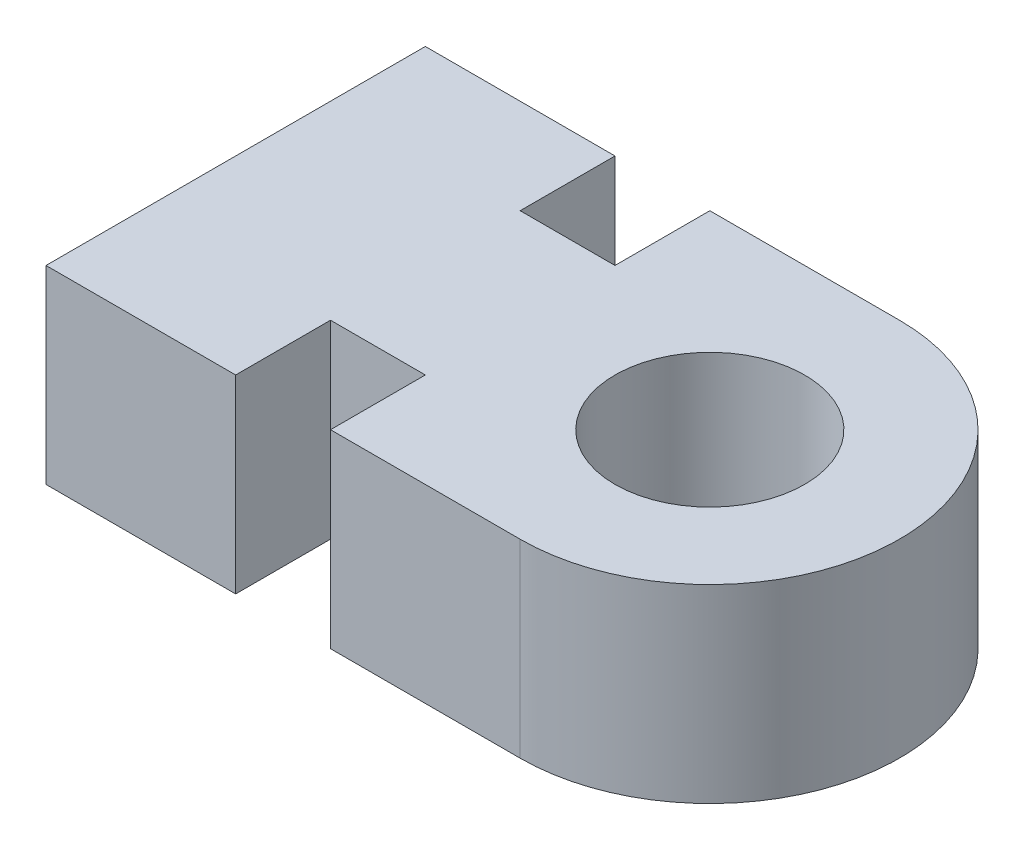
ISO-10303-21;
HEADER;
FILE_DESCRIPTION(('STEP AP214'),'2;1');
FILE_NAME('part.step','',(''),(''),'','','');
FILE_SCHEMA(('AUTOMOTIVE_DESIGN { 1 0 10303 214 1 1 1 1 }'));
ENDSEC;
DATA;
#1=APPLICATION_CONTEXT('core data for automotive mechanical design processes');
#2=APPLICATION_PROTOCOL_DEFINITION('international standard','automotive_design',2000,#1);
#3=PRODUCT_CONTEXT('',#1,'mechanical');
#4=PRODUCT('Part','Part','',(#3));
#5=PRODUCT_RELATED_PRODUCT_CATEGORY('part','',(#4));
#6=PRODUCT_DEFINITION_FORMATION('','',#4);
#7=PRODUCT_DEFINITION_CONTEXT('part definition',#1,'design');
#8=PRODUCT_DEFINITION('design','',#6,#7);
#9=PRODUCT_DEFINITION_SHAPE('','',#8);
#10=(LENGTH_UNIT() NAMED_UNIT(*) SI_UNIT(.MILLI.,.METRE.));
#11=(NAMED_UNIT(*) PLANE_ANGLE_UNIT() SI_UNIT($,.RADIAN.));
#12=(NAMED_UNIT(*) SI_UNIT($,.STERADIAN.) SOLID_ANGLE_UNIT());
#13=UNCERTAINTY_MEASURE_WITH_UNIT(LENGTH_MEASURE(1.E-05),#10,'distance_accuracy_value','');
#14=(GEOMETRIC_REPRESENTATION_CONTEXT(3) GLOBAL_UNCERTAINTY_ASSIGNED_CONTEXT((#13)) GLOBAL_UNIT_ASSIGNED_CONTEXT((#10,
#11,#12)) REPRESENTATION_CONTEXT('',''));
#15=CARTESIAN_POINT('',(0.,0.,0.));
#16=DIRECTION('',(0.,0.,1.));
#17=DIRECTION('',(1.,0.,0.));
#18=AXIS2_PLACEMENT_3D('',#15,#16,#17);
#19=CARTESIAN_POINT('',(0.,20.,0.));
#20=DIRECTION('',(0.,1.,0.));
#21=DIRECTION('',(0.,0.,1.));
#22=AXIS2_PLACEMENT_3D('',#19,#20,#21);
#23=PLANE('',#22);
#24=CARTESIAN_POINT('',(0.,20.,0.));
#25=DIRECTION('',(0.,1.,0.));
#26=DIRECTION('',(0.,0.,1.));
#27=AXIS2_PLACEMENT_3D('',#24,#25,#26);
#28=CIRCLE('',#27,20.);
#29=CARTESIAN_POINT('',(0.,20.,20.));
#30=VERTEX_POINT('',#29);
#31=CARTESIAN_POINT('',(0.,20.,-20.));
#32=VERTEX_POINT('',#31);
#33=EDGE_CURVE('E180',#30,#32,#28,.T.);
#34=ORIENTED_EDGE('',*,*,#33,.T.);
#35=DIRECTION('',(-1.,0.,0.));
#36=VECTOR('',#35,1.);
#37=CARTESIAN_POINT('',(0.,20.,-20.));
#38=LINE('',#37,#36);
#39=CARTESIAN_POINT('',(-20.,20.,-20.));
#40=VERTEX_POINT('',#39);
#41=EDGE_CURVE('E108',#32,#40,#38,.T.);
#42=ORIENTED_EDGE('',*,*,#41,.T.);
#43=DIRECTION('',(0.,0.,1.));
#44=VECTOR('',#43,1.);
#45=CARTESIAN_POINT('',(-20.,20.,-20.));
#46=LINE('',#45,#44);
#47=CARTESIAN_POINT('',(-20.,20.,-10.));
#48=VERTEX_POINT('',#47);
#49=EDGE_CURVE('E207',#40,#48,#46,.T.);
#50=ORIENTED_EDGE('',*,*,#49,.T.);
#51=DIRECTION('',(-1.,0.,0.));
#52=VECTOR('',#51,1.);
#53=CARTESIAN_POINT('',(-20.,20.,-10.));
#54=LINE('',#53,#52);
#55=CARTESIAN_POINT('',(-30.,20.,-10.));
#56=VERTEX_POINT('',#55);
#57=EDGE_CURVE('E226',#48,#56,#54,.T.);
#58=ORIENTED_EDGE('',*,*,#57,.T.);
#59=DIRECTION('',(0.,0.,-1.));
#60=VECTOR('',#59,1.);
#61=CARTESIAN_POINT('',(-30.,20.,-10.));
#62=LINE('',#61,#60);
#63=CARTESIAN_POINT('',(-30.,20.,-20.));
#64=VERTEX_POINT('',#63);
#65=EDGE_CURVE('E223',#56,#64,#62,.T.);
#66=ORIENTED_EDGE('',*,*,#65,.T.);
#67=DIRECTION('',(-1.,0.,0.));
#68=VECTOR('',#67,1.);
#69=CARTESIAN_POINT('',(-30.,20.,-20.));
#70=LINE('',#69,#68);
#71=CARTESIAN_POINT('',(-50.,20.,-20.));
#72=VERTEX_POINT('',#71);
#73=EDGE_CURVE('E225',#64,#72,#70,.T.);
#74=ORIENTED_EDGE('',*,*,#73,.T.);
#75=DIRECTION('',(0.,0.,1.));
#76=VECTOR('',#75,1.);
#77=CARTESIAN_POINT('',(-50.,20.,-20.));
#78=LINE('',#77,#76);
#79=CARTESIAN_POINT('',(-50.,20.,20.));
#80=VERTEX_POINT('',#79);
#81=EDGE_CURVE('E228',#72,#80,#78,.T.);
#82=ORIENTED_EDGE('',*,*,#81,.T.);
#83=DIRECTION('',(1.,0.,0.));
#84=VECTOR('',#83,1.);
#85=CARTESIAN_POINT('',(-50.,20.,20.));
#86=LINE('',#85,#84);
#87=CARTESIAN_POINT('',(-30.,20.,20.));
#88=VERTEX_POINT('',#87);
#89=EDGE_CURVE('E234',#80,#88,#86,.T.);
#90=ORIENTED_EDGE('',*,*,#89,.T.);
#91=DIRECTION('',(0.,0.,-1.));
#92=VECTOR('',#91,1.);
#93=CARTESIAN_POINT('',(-30.,20.,20.));
#94=LINE('',#93,#92);
#95=CARTESIAN_POINT('',(-30.,20.,10.));
#96=VERTEX_POINT('',#95);
#97=EDGE_CURVE('E139',#88,#96,#94,.T.);
#98=ORIENTED_EDGE('',*,*,#97,.T.);
#99=DIRECTION('',(1.,0.,0.));
#100=VECTOR('',#99,1.);
#101=CARTESIAN_POINT('',(-30.,20.,10.));
#102=LINE('',#101,#100);
#103=CARTESIAN_POINT('',(-20.,20.,10.));
#104=VERTEX_POINT('',#103);
#105=EDGE_CURVE('E133',#96,#104,#102,.T.);
#106=ORIENTED_EDGE('',*,*,#105,.T.);
#107=DIRECTION('',(0.,0.,1.));
#108=VECTOR('',#107,1.);
#109=CARTESIAN_POINT('',(-20.,20.,10.));
#110=LINE('',#109,#108);
#111=CARTESIAN_POINT('',(-20.,20.,20.));
#112=VERTEX_POINT('',#111);
#113=EDGE_CURVE('E137',#104,#112,#110,.T.);
#114=ORIENTED_EDGE('',*,*,#113,.T.);
#115=DIRECTION('',(1.,0.,0.));
#116=VECTOR('',#115,1.);
#117=CARTESIAN_POINT('',(-20.,20.,20.));
#118=LINE('',#117,#116);
#119=EDGE_CURVE('E53',#112,#30,#118,.T.);
#120=ORIENTED_EDGE('',*,*,#119,.T.);
#121=EDGE_LOOP('',(#34,#42,#50,#58,#66,#74,#82,#90,#98,#106,#114,#120));
#122=FACE_BOUND('',#121,.T.);
#123=CARTESIAN_POINT('',(0.,20.,0.));
#124=DIRECTION('',(0.,1.,0.));
#125=DIRECTION('',(0.,0.,1.));
#126=AXIS2_PLACEMENT_3D('',#123,#124,#125);
#127=CIRCLE('',#126,10.);
#128=CARTESIAN_POINT('',(0.,20.,10.));
#129=VERTEX_POINT('',#128);
#130=EDGE_CURVE('E161',#129,#129,#127,.T.);
#131=ORIENTED_EDGE('',*,*,#130,.F.);
#132=EDGE_LOOP('',(#131));
#133=FACE_BOUND('',#132,.T.);
#134=ADVANCED_FACE('F36',(#122,#133),#23,.T.);
#135=CARTESIAN_POINT('',(0.,0.,0.));
#136=DIRECTION('',(0.,1.,0.));
#137=DIRECTION('',(0.,0.,1.));
#138=AXIS2_PLACEMENT_3D('',#135,#136,#137);
#139=PLANE('',#138);
#140=CARTESIAN_POINT('',(0.,0.,0.));
#141=DIRECTION('',(0.,1.,0.));
#142=DIRECTION('',(0.,0.,1.));
#143=AXIS2_PLACEMENT_3D('',#140,#141,#142);
#144=CIRCLE('',#143,20.);
#145=CARTESIAN_POINT('',(0.,0.,20.));
#146=VERTEX_POINT('',#145);
#147=CARTESIAN_POINT('',(0.,0.,-20.));
#148=VERTEX_POINT('',#147);
#149=EDGE_CURVE('E157',#146,#148,#144,.T.);
#150=ORIENTED_EDGE('',*,*,#149,.F.);
#151=DIRECTION('',(1.,0.,0.));
#152=VECTOR('',#151,1.);
#153=CARTESIAN_POINT('',(-20.,0.,20.));
#154=LINE('',#153,#152);
#155=CARTESIAN_POINT('',(-20.,0.,20.));
#156=VERTEX_POINT('',#155);
#157=EDGE_CURVE('E100',#156,#146,#154,.T.);
#158=ORIENTED_EDGE('',*,*,#157,.F.);
#159=DIRECTION('',(0.,0.,1.));
#160=VECTOR('',#159,1.);
#161=CARTESIAN_POINT('',(-20.,0.,10.));
#162=LINE('',#161,#160);
#163=CARTESIAN_POINT('',(-20.,0.,10.));
#164=VERTEX_POINT('',#163);
#165=EDGE_CURVE('E94',#164,#156,#162,.T.);
#166=ORIENTED_EDGE('',*,*,#165,.F.);
#167=DIRECTION('',(1.,0.,0.));
#168=VECTOR('',#167,1.);
#169=CARTESIAN_POINT('',(-30.,0.,10.));
#170=LINE('',#169,#168);
#171=CARTESIAN_POINT('',(-30.,0.,10.));
#172=VERTEX_POINT('',#171);
#173=EDGE_CURVE('E147',#172,#164,#170,.T.);
#174=ORIENTED_EDGE('',*,*,#173,.F.);
#175=DIRECTION('',(0.,0.,-1.));
#176=VECTOR('',#175,1.);
#177=CARTESIAN_POINT('',(-30.,0.,20.));
#178=LINE('',#177,#176);
#179=CARTESIAN_POINT('',(-30.,0.,20.));
#180=VERTEX_POINT('',#179);
#181=EDGE_CURVE('E175',#180,#172,#178,.T.);
#182=ORIENTED_EDGE('',*,*,#181,.F.);
#183=DIRECTION('',(1.,0.,0.));
#184=VECTOR('',#183,1.);
#185=CARTESIAN_POINT('',(-50.,0.,20.));
#186=LINE('',#185,#184);
#187=CARTESIAN_POINT('',(-50.,0.,20.));
#188=VERTEX_POINT('',#187);
#189=EDGE_CURVE('E173',#188,#180,#186,.T.);
#190=ORIENTED_EDGE('',*,*,#189,.F.);
#191=DIRECTION('',(0.,0.,1.));
#192=VECTOR('',#191,1.);
#193=CARTESIAN_POINT('',(-50.,0.,-20.));
#194=LINE('',#193,#192);
#195=CARTESIAN_POINT('',(-50.,0.,-20.));
#196=VERTEX_POINT('',#195);
#197=EDGE_CURVE('E171',#196,#188,#194,.T.);
#198=ORIENTED_EDGE('',*,*,#197,.F.);
#199=DIRECTION('',(-1.,0.,0.));
#200=VECTOR('',#199,1.);
#201=CARTESIAN_POINT('',(-30.,0.,-20.));
#202=LINE('',#201,#200);
#203=CARTESIAN_POINT('',(-30.,0.,-20.));
#204=VERTEX_POINT('',#203);
#205=EDGE_CURVE('E169',#204,#196,#202,.T.);
#206=ORIENTED_EDGE('',*,*,#205,.F.);
#207=DIRECTION('',(0.,0.,-1.));
#208=VECTOR('',#207,1.);
#209=CARTESIAN_POINT('',(-30.,0.,-10.));
#210=LINE('',#209,#208);
#211=CARTESIAN_POINT('',(-30.,0.,-10.));
#212=VERTEX_POINT('',#211);
#213=EDGE_CURVE('E167',#212,#204,#210,.T.);
#214=ORIENTED_EDGE('',*,*,#213,.F.);
#215=DIRECTION('',(-1.,0.,0.));
#216=VECTOR('',#215,1.);
#217=CARTESIAN_POINT('',(-20.,0.,-10.));
#218=LINE('',#217,#216);
#219=CARTESIAN_POINT('',(-20.,0.,-10.));
#220=VERTEX_POINT('',#219);
#221=EDGE_CURVE('E165',#220,#212,#218,.T.);
#222=ORIENTED_EDGE('',*,*,#221,.F.);
#223=DIRECTION('',(0.,0.,1.));
#224=VECTOR('',#223,1.);
#225=CARTESIAN_POINT('',(-20.,0.,-20.));
#226=LINE('',#225,#224);
#227=CARTESIAN_POINT('',(-20.,0.,-20.));
#228=VERTEX_POINT('',#227);
#229=EDGE_CURVE('E163',#228,#220,#226,.T.);
#230=ORIENTED_EDGE('',*,*,#229,.F.);
#231=DIRECTION('',(-1.,0.,0.));
#232=VECTOR('',#231,1.);
#233=CARTESIAN_POINT('',(0.,0.,-20.));
#234=LINE('',#233,#232);
#235=EDGE_CURVE('E160',#148,#228,#234,.T.);
#236=ORIENTED_EDGE('',*,*,#235,.F.);
#237=EDGE_LOOP('',(#150,#158,#166,#174,#182,#190,#198,#206,#214,#222,#230,#236));
#238=FACE_BOUND('',#237,.T.);
#239=CARTESIAN_POINT('',(0.,0.,0.));
#240=DIRECTION('',(0.,1.,0.));
#241=DIRECTION('',(0.,0.,1.));
#242=AXIS2_PLACEMENT_3D('',#239,#240,#241);
#243=CIRCLE('',#242,10.);
#244=CARTESIAN_POINT('',(0.,0.,10.));
#245=VERTEX_POINT('',#244);
#246=EDGE_CURVE('E381',#245,#245,#243,.T.);
#247=ORIENTED_EDGE('',*,*,#246,.T.);
#248=EDGE_LOOP('',(#247));
#249=FACE_BOUND('',#248,.T.);
#250=ADVANCED_FACE('F211',(#238,#249),#139,.F.);
#251=CARTESIAN_POINT('',(0.,20.,0.));
#252=DIRECTION('',(0.,-1.,0.));
#253=DIRECTION('',(0.,0.,-1.));
#254=AXIS2_PLACEMENT_3D('',#251,#252,#253);
#255=CYLINDRICAL_SURFACE('',#254,20.);
#256=ORIENTED_EDGE('',*,*,#149,.T.);
#257=DIRECTION('',(0.,-1.,0.));
#258=VECTOR('',#257,1.);
#259=CARTESIAN_POINT('',(0.,20.,-20.));
#260=LINE('',#259,#258);
#261=EDGE_CURVE('E11',#32,#148,#260,.T.);
#262=ORIENTED_EDGE('',*,*,#261,.F.);
#263=ORIENTED_EDGE('',*,*,#33,.F.);
#264=DIRECTION('',(0.,-1.,0.));
#265=VECTOR('',#264,1.);
#266=CARTESIAN_POINT('',(0.,20.,20.));
#267=LINE('',#266,#265);
#268=EDGE_CURVE('E153',#30,#146,#267,.T.);
#269=ORIENTED_EDGE('',*,*,#268,.T.);
#270=EDGE_LOOP('',(#256,#262,#263,#269));
#271=FACE_BOUND('',#270,.T.);
#272=ADVANCED_FACE('F38',(#271),#255,.T.);
#273=CARTESIAN_POINT('',(0.,20.,-20.));
#274=DIRECTION('',(0.,0.,1.));
#275=DIRECTION('',(1.,0.,0.));
#276=AXIS2_PLACEMENT_3D('',#273,#274,#275);
#277=PLANE('',#276);
#278=ORIENTED_EDGE('',*,*,#235,.T.);
#279=DIRECTION('',(0.,-1.,0.));
#280=VECTOR('',#279,1.);
#281=CARTESIAN_POINT('',(-20.,20.,-20.));
#282=LINE('',#281,#280);
#283=EDGE_CURVE('E45',#40,#228,#282,.T.);
#284=ORIENTED_EDGE('',*,*,#283,.F.);
#285=ORIENTED_EDGE('',*,*,#41,.F.);
#286=ORIENTED_EDGE('',*,*,#261,.T.);
#287=EDGE_LOOP('',(#278,#284,#285,#286));
#288=FACE_BOUND('',#287,.T.);
#289=ADVANCED_FACE('F268',(#288),#277,.F.);
#290=CARTESIAN_POINT('',(-20.,20.,-20.));
#291=DIRECTION('',(1.,0.,0.));
#292=DIRECTION('',(0.,0.,-1.));
#293=AXIS2_PLACEMENT_3D('',#290,#291,#292);
#294=PLANE('',#293);
#295=ORIENTED_EDGE('',*,*,#229,.T.);
#296=DIRECTION('',(0.,-1.,0.));
#297=VECTOR('',#296,1.);
#298=CARTESIAN_POINT('',(-20.,20.,-10.));
#299=LINE('',#298,#297);
#300=EDGE_CURVE('E199',#48,#220,#299,.T.);
#301=ORIENTED_EDGE('',*,*,#300,.F.);
#302=ORIENTED_EDGE('',*,*,#49,.F.);
#303=ORIENTED_EDGE('',*,*,#283,.T.);
#304=EDGE_LOOP('',(#295,#301,#302,#303));
#305=FACE_BOUND('',#304,.T.);
#306=ADVANCED_FACE('F205',(#305),#294,.F.);
#307=CARTESIAN_POINT('',(-20.,20.,-10.));
#308=DIRECTION('',(0.,0.,1.));
#309=DIRECTION('',(1.,0.,0.));
#310=AXIS2_PLACEMENT_3D('',#307,#308,#309);
#311=PLANE('',#310);
#312=ORIENTED_EDGE('',*,*,#221,.T.);
#313=DIRECTION('',(0.,-1.,0.));
#314=VECTOR('',#313,1.);
#315=CARTESIAN_POINT('',(-30.,20.,-10.));
#316=LINE('',#315,#314);
#317=EDGE_CURVE('E196',#56,#212,#316,.T.);
#318=ORIENTED_EDGE('',*,*,#317,.F.);
#319=ORIENTED_EDGE('',*,*,#57,.F.);
#320=ORIENTED_EDGE('',*,*,#300,.T.);
#321=EDGE_LOOP('',(#312,#318,#319,#320));
#322=FACE_BOUND('',#321,.T.);
#323=ADVANCED_FACE('F217',(#322),#311,.F.);
#324=CARTESIAN_POINT('',(-30.,20.,-10.));
#325=DIRECTION('',(-1.,0.,0.));
#326=DIRECTION('',(0.,0.,1.));
#327=AXIS2_PLACEMENT_3D('',#324,#325,#326);
#328=PLANE('',#327);
#329=ORIENTED_EDGE('',*,*,#213,.T.);
#330=DIRECTION('',(0.,-1.,0.));
#331=VECTOR('',#330,1.);
#332=CARTESIAN_POINT('',(-30.,20.,-20.));
#333=LINE('',#332,#331);
#334=EDGE_CURVE('E193',#64,#204,#333,.T.);
#335=ORIENTED_EDGE('',*,*,#334,.F.);
#336=ORIENTED_EDGE('',*,*,#65,.F.);
#337=ORIENTED_EDGE('',*,*,#317,.T.);
#338=EDGE_LOOP('',(#329,#335,#336,#337));
#339=FACE_BOUND('',#338,.T.);
#340=ADVANCED_FACE('F221',(#339),#328,.F.);
#341=CARTESIAN_POINT('',(-30.,20.,-20.));
#342=DIRECTION('',(0.,0.,1.));
#343=DIRECTION('',(1.,0.,0.));
#344=AXIS2_PLACEMENT_3D('',#341,#342,#343);
#345=PLANE('',#344);
#346=ORIENTED_EDGE('',*,*,#205,.T.);
#347=DIRECTION('',(0.,-1.,0.));
#348=VECTOR('',#347,1.);
#349=CARTESIAN_POINT('',(-50.,20.,-20.));
#350=LINE('',#349,#348);
#351=EDGE_CURVE('E190',#72,#196,#350,.T.);
#352=ORIENTED_EDGE('',*,*,#351,.F.);
#353=ORIENTED_EDGE('',*,*,#73,.F.);
#354=ORIENTED_EDGE('',*,*,#334,.T.);
#355=EDGE_LOOP('',(#346,#352,#353,#354));
#356=FACE_BOUND('',#355,.T.);
#357=ADVANCED_FACE('F281',(#356),#345,.F.);
#358=CARTESIAN_POINT('',(-50.,20.,-20.));
#359=DIRECTION('',(1.,0.,0.));
#360=DIRECTION('',(0.,0.,-1.));
#361=AXIS2_PLACEMENT_3D('',#358,#359,#360);
#362=PLANE('',#361);
#363=ORIENTED_EDGE('',*,*,#197,.T.);
#364=DIRECTION('',(0.,-1.,0.));
#365=VECTOR('',#364,1.);
#366=CARTESIAN_POINT('',(-50.,20.,20.));
#367=LINE('',#366,#365);
#368=EDGE_CURVE('E187',#80,#188,#367,.T.);
#369=ORIENTED_EDGE('',*,*,#368,.F.);
#370=ORIENTED_EDGE('',*,*,#81,.F.);
#371=ORIENTED_EDGE('',*,*,#351,.T.);
#372=EDGE_LOOP('',(#363,#369,#370,#371));
#373=FACE_BOUND('',#372,.T.);
#374=ADVANCED_FACE('F284',(#373),#362,.F.);
#375=CARTESIAN_POINT('',(-50.,20.,20.));
#376=DIRECTION('',(0.,0.,-1.));
#377=DIRECTION('',(-1.,0.,0.));
#378=AXIS2_PLACEMENT_3D('',#375,#376,#377);
#379=PLANE('',#378);
#380=ORIENTED_EDGE('',*,*,#189,.T.);
#381=DIRECTION('',(0.,-1.,0.));
#382=VECTOR('',#381,1.);
#383=CARTESIAN_POINT('',(-30.,20.,20.));
#384=LINE('',#383,#382);
#385=EDGE_CURVE('E184',#88,#180,#384,.T.);
#386=ORIENTED_EDGE('',*,*,#385,.F.);
#387=ORIENTED_EDGE('',*,*,#89,.F.);
#388=ORIENTED_EDGE('',*,*,#368,.T.);
#389=EDGE_LOOP('',(#380,#386,#387,#388));
#390=FACE_BOUND('',#389,.T.);
#391=ADVANCED_FACE('F240',(#390),#379,.F.);
#392=CARTESIAN_POINT('',(-30.,20.,20.));
#393=DIRECTION('',(-1.,0.,0.));
#394=DIRECTION('',(0.,0.,1.));
#395=AXIS2_PLACEMENT_3D('',#392,#393,#394);
#396=PLANE('',#395);
#397=ORIENTED_EDGE('',*,*,#181,.T.);
#398=DIRECTION('',(0.,-1.,0.));
#399=VECTOR('',#398,1.);
#400=CARTESIAN_POINT('',(-30.,20.,10.));
#401=LINE('',#400,#399);
#402=EDGE_CURVE('E148',#96,#172,#401,.T.);
#403=ORIENTED_EDGE('',*,*,#402,.F.);
#404=ORIENTED_EDGE('',*,*,#97,.F.);
#405=ORIENTED_EDGE('',*,*,#385,.T.);
#406=EDGE_LOOP('',(#397,#403,#404,#405));
#407=FACE_BOUND('',#406,.T.);
#408=ADVANCED_FACE('F244',(#407),#396,.F.);
#409=CARTESIAN_POINT('',(-30.,20.,10.));
#410=DIRECTION('',(0.,0.,-1.));
#411=DIRECTION('',(-1.,0.,0.));
#412=AXIS2_PLACEMENT_3D('',#409,#410,#411);
#413=PLANE('',#412);
#414=ORIENTED_EDGE('',*,*,#173,.T.);
#415=DIRECTION('',(0.,-1.,0.));
#416=VECTOR('',#415,1.);
#417=CARTESIAN_POINT('',(-20.,20.,10.));
#418=LINE('',#417,#416);
#419=EDGE_CURVE('E144',#104,#164,#418,.T.);
#420=ORIENTED_EDGE('',*,*,#419,.F.);
#421=ORIENTED_EDGE('',*,*,#105,.F.);
#422=ORIENTED_EDGE('',*,*,#402,.T.);
#423=EDGE_LOOP('',(#414,#420,#421,#422));
#424=FACE_BOUND('',#423,.T.);
#425=ADVANCED_FACE('F145',(#424),#413,.F.);
#426=CARTESIAN_POINT('',(-20.,20.,10.));
#427=DIRECTION('',(1.,0.,0.));
#428=DIRECTION('',(0.,0.,-1.));
#429=AXIS2_PLACEMENT_3D('',#426,#427,#428);
#430=PLANE('',#429);
#431=ORIENTED_EDGE('',*,*,#165,.T.);
#432=DIRECTION('',(0.,-1.,0.));
#433=VECTOR('',#432,1.);
#434=CARTESIAN_POINT('',(-20.,20.,20.));
#435=LINE('',#434,#433);
#436=EDGE_CURVE('E149',#112,#156,#435,.T.);
#437=ORIENTED_EDGE('',*,*,#436,.F.);
#438=ORIENTED_EDGE('',*,*,#113,.F.);
#439=ORIENTED_EDGE('',*,*,#419,.T.);
#440=EDGE_LOOP('',(#431,#437,#438,#439));
#441=FACE_BOUND('',#440,.T.);
#442=ADVANCED_FACE('F151',(#441),#430,.F.);
#443=CARTESIAN_POINT('',(-20.,20.,20.));
#444=DIRECTION('',(0.,0.,-1.));
#445=DIRECTION('',(-1.,0.,0.));
#446=AXIS2_PLACEMENT_3D('',#443,#444,#445);
#447=PLANE('',#446);
#448=ORIENTED_EDGE('',*,*,#157,.T.);
#449=ORIENTED_EDGE('',*,*,#268,.F.);
#450=ORIENTED_EDGE('',*,*,#119,.F.);
#451=ORIENTED_EDGE('',*,*,#436,.T.);
#452=EDGE_LOOP('',(#448,#449,#450,#451));
#453=FACE_BOUND('',#452,.T.);
#454=ADVANCED_FACE('F248',(#453),#447,.F.);
#455=CARTESIAN_POINT('',(0.,20.,0.));
#456=DIRECTION('',(0.,-1.,0.));
#457=DIRECTION('',(0.,0.,-1.));
#458=AXIS2_PLACEMENT_3D('',#455,#456,#457);
#459=CYLINDRICAL_SURFACE('',#458,10.);
#460=ORIENTED_EDGE('',*,*,#130,.T.);
#461=EDGE_LOOP('',(#460));
#462=FACE_BOUND('',#461,.T.);
#463=ORIENTED_EDGE('',*,*,#246,.F.);
#464=EDGE_LOOP('',(#463));
#465=FACE_BOUND('',#464,.T.);
#466=ADVANCED_FACE('F250',(#462,#465),#459,.F.);
#467=CLOSED_SHELL('',(#134,#250,#272,#289,#306,#323,#340,#357,#374,#391,#408,#425,#442,#454,#466));
#468=MANIFOLD_SOLID_BREP('B2',#467);
#469=ADVANCED_BREP_SHAPE_REPRESENTATION('',(#18,#468),#14);
#470=SHAPE_DEFINITION_REPRESENTATION(#9,#469);
ENDSEC;
END-ISO-10303-21;
